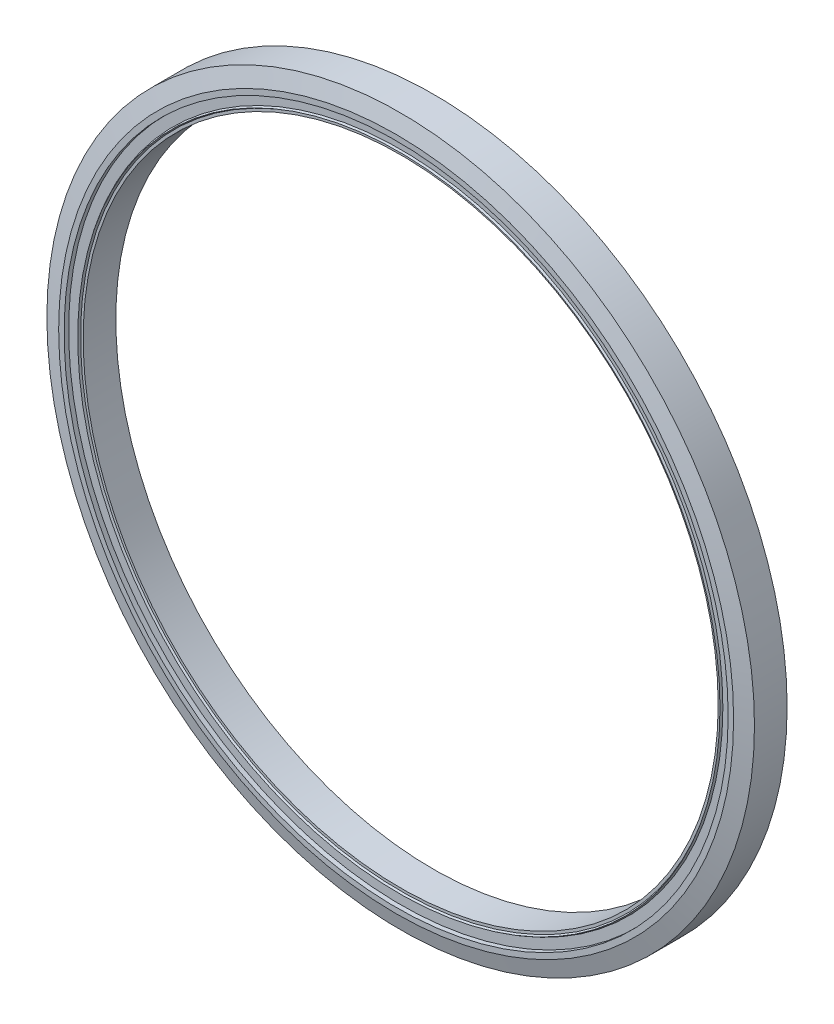
ISO-10303-21;
HEADER;
FILE_DESCRIPTION(('STEP AP214'),'2;1');
FILE_NAME('part.step','',(''),(''),'','','');
FILE_SCHEMA(('AUTOMOTIVE_DESIGN { 1 0 10303 214 1 1 1 1 }'));
ENDSEC;
DATA;
#1=APPLICATION_CONTEXT('core data for automotive mechanical design processes');
#2=APPLICATION_PROTOCOL_DEFINITION('international standard','automotive_design',2000,#1);
#3=PRODUCT_CONTEXT('',#1,'mechanical');
#4=PRODUCT('Part','Part','',(#3));
#5=PRODUCT_RELATED_PRODUCT_CATEGORY('part','',(#4));
#6=PRODUCT_DEFINITION_FORMATION('','',#4);
#7=PRODUCT_DEFINITION_CONTEXT('part definition',#1,'design');
#8=PRODUCT_DEFINITION('design','',#6,#7);
#9=PRODUCT_DEFINITION_SHAPE('','',#8);
#10=(LENGTH_UNIT() NAMED_UNIT(*) SI_UNIT(.MILLI.,.METRE.));
#11=(NAMED_UNIT(*) PLANE_ANGLE_UNIT() SI_UNIT($,.RADIAN.));
#12=(NAMED_UNIT(*) SI_UNIT($,.STERADIAN.) SOLID_ANGLE_UNIT());
#13=UNCERTAINTY_MEASURE_WITH_UNIT(LENGTH_MEASURE(1.E-05),#10,'distance_accuracy_value','');
#14=(GEOMETRIC_REPRESENTATION_CONTEXT(3) GLOBAL_UNCERTAINTY_ASSIGNED_CONTEXT((#13)) GLOBAL_UNIT_ASSIGNED_CONTEXT((#10,
#11,#12)) REPRESENTATION_CONTEXT('',''));
#15=CARTESIAN_POINT('',(0.,0.,0.));
#16=DIRECTION('',(0.,0.,1.));
#17=DIRECTION('',(1.,0.,0.));
#18=AXIS2_PLACEMENT_3D('',#15,#16,#17);
#19=CARTESIAN_POINT('',(0.,0.,0.9));
#20=DIRECTION('',(0.,0.,-1.));
#21=DIRECTION('',(-1.,0.,0.));
#22=AXIS2_PLACEMENT_3D('',#19,#20,#21);
#23=CONICAL_SURFACE('',#22,19.5,1.29984947645648);
#24=CARTESIAN_POINT('',(0.,0.,1.15));
#25=DIRECTION('',(0.,0.,1.));
#26=DIRECTION('',(1.,0.,0.));
#27=AXIS2_PLACEMENT_3D('',#24,#25,#26);
#28=CIRCLE('',#27,18.6);
#29=CARTESIAN_POINT('',(18.6,0.,1.15));
#30=VERTEX_POINT('',#29);
#31=EDGE_CURVE('E10',#30,#30,#28,.T.);
#32=ORIENTED_EDGE('',*,*,#31,.F.);
#33=EDGE_LOOP('',(#32));
#34=FACE_BOUND('',#33,.T.);
#35=CARTESIAN_POINT('',(0.,0.,0.9));
#36=DIRECTION('',(0.,0.,1.));
#37=DIRECTION('',(1.,0.,0.));
#38=AXIS2_PLACEMENT_3D('',#35,#36,#37);
#39=CIRCLE('',#38,19.5);
#40=CARTESIAN_POINT('',(19.5,0.,0.9));
#41=VERTEX_POINT('',#40);
#42=EDGE_CURVE('E93',#41,#41,#39,.T.);
#43=ORIENTED_EDGE('',*,*,#42,.T.);
#44=EDGE_LOOP('',(#43));
#45=FACE_BOUND('',#44,.T.);
#46=ADVANCED_FACE('F41',(#34,#45),#23,.T.);
#47=CARTESIAN_POINT('',(0.,18.3,1.15));
#48=DIRECTION('',(0.,0.,-1.));
#49=DIRECTION('',(-1.,0.,0.));
#50=AXIS2_PLACEMENT_3D('',#47,#48,#49);
#51=PLANE('',#50);
#52=CARTESIAN_POINT('',(0.,0.,1.15));
#53=DIRECTION('',(0.,0.,1.));
#54=DIRECTION('',(1.,0.,0.));
#55=AXIS2_PLACEMENT_3D('',#52,#53,#54);
#56=CIRCLE('',#55,18.3);
#57=CARTESIAN_POINT('',(18.3,0.,1.15));
#58=VERTEX_POINT('',#57);
#59=EDGE_CURVE('E47',#58,#58,#56,.T.);
#60=ORIENTED_EDGE('',*,*,#59,.F.);
#61=EDGE_LOOP('',(#60));
#62=FACE_BOUND('',#61,.T.);
#63=ORIENTED_EDGE('',*,*,#31,.T.);
#64=EDGE_LOOP('',(#63));
#65=FACE_BOUND('',#64,.T.);
#66=ADVANCED_FACE('F178',(#62,#65),#51,.F.);
#67=CARTESIAN_POINT('',(0.,0.,0.));
#68=DIRECTION('',(0.,0.,1.));
#69=DIRECTION('',(1.,0.,0.));
#70=AXIS2_PLACEMENT_3D('',#67,#68,#69);
#71=CYLINDRICAL_SURFACE('',#70,18.3);
#72=CARTESIAN_POINT('',(0.,0.,0.899999999999998));
#73=DIRECTION('',(0.,0.,1.));
#74=DIRECTION('',(1.,0.,0.));
#75=AXIS2_PLACEMENT_3D('',#72,#73,#74);
#76=CIRCLE('',#75,18.3);
#77=CARTESIAN_POINT('',(18.3,0.,0.899999999999998));
#78=VERTEX_POINT('',#77);
#79=EDGE_CURVE('E51',#78,#78,#76,.T.);
#80=ORIENTED_EDGE('',*,*,#79,.F.);
#81=EDGE_LOOP('',(#80));
#82=FACE_BOUND('',#81,.T.);
#83=ORIENTED_EDGE('',*,*,#59,.T.);
#84=EDGE_LOOP('',(#83));
#85=FACE_BOUND('',#84,.T.);
#86=ADVANCED_FACE('F173',(#82,#85),#71,.F.);
#87=CARTESIAN_POINT('',(0.,18.3,0.899999999999998));
#88=DIRECTION('',(0.,0.,-1.));
#89=DIRECTION('',(-1.,0.,0.));
#90=AXIS2_PLACEMENT_3D('',#87,#88,#89);
#91=PLANE('',#90);
#92=CARTESIAN_POINT('',(0.,0.,0.899999999999998));
#93=DIRECTION('',(0.,0.,1.));
#94=DIRECTION('',(1.,0.,0.));
#95=AXIS2_PLACEMENT_3D('',#92,#93,#94);
#96=CIRCLE('',#95,17.757735026919);
#97=CARTESIAN_POINT('',(17.757735026919,0.,0.899999999999998));
#98=VERTEX_POINT('',#97);
#99=EDGE_CURVE('E55',#98,#98,#96,.T.);
#100=ORIENTED_EDGE('',*,*,#99,.F.);
#101=EDGE_LOOP('',(#100));
#102=FACE_BOUND('',#101,.T.);
#103=ORIENTED_EDGE('',*,*,#79,.T.);
#104=EDGE_LOOP('',(#103));
#105=FACE_BOUND('',#104,.T.);
#106=ADVANCED_FACE('F167',(#102,#105),#91,.F.);
#107=CARTESIAN_POINT('',(0.,0.,0.899999999999998));
#108=DIRECTION('',(0.,0.,-1.));
#109=DIRECTION('',(-1.,0.,0.));
#110=AXIS2_PLACEMENT_3D('',#107,#108,#109);
#111=CONICAL_SURFACE('',#110,17.757735026919,0.523598775598298);
#112=CARTESIAN_POINT('',(0.,0.,1.));
#113=DIRECTION('',(0.,0.,1.));
#114=DIRECTION('',(1.,0.,0.));
#115=AXIS2_PLACEMENT_3D('',#112,#113,#114);
#116=CIRCLE('',#115,17.7);
#117=CARTESIAN_POINT('',(17.7,0.,1.));
#118=VERTEX_POINT('',#117);
#119=EDGE_CURVE('E60',#118,#118,#116,.T.);
#120=ORIENTED_EDGE('',*,*,#119,.F.);
#121=EDGE_LOOP('',(#120));
#122=FACE_BOUND('',#121,.T.);
#123=ORIENTED_EDGE('',*,*,#99,.T.);
#124=EDGE_LOOP('',(#123));
#125=FACE_BOUND('',#124,.T.);
#126=ADVANCED_FACE('F161',(#122,#125),#111,.T.);
#127=CARTESIAN_POINT('',(0.,0.,1.));
#128=DIRECTION('',(0.,0.,1.));
#129=DIRECTION('',(1.,0.,0.));
#130=AXIS2_PLACEMENT_3D('',#127,#128,#129);
#131=CONICAL_SURFACE('',#130,17.7,0.523598775598298);
#132=CARTESIAN_POINT('',(0.,0.,0.899999999999998));
#133=DIRECTION('',(0.,0.,1.));
#134=DIRECTION('',(1.,0.,0.));
#135=AXIS2_PLACEMENT_3D('',#132,#133,#134);
#136=CIRCLE('',#135,17.642264973081);
#137=CARTESIAN_POINT('',(17.642264973081,0.,0.899999999999998));
#138=VERTEX_POINT('',#137);
#139=EDGE_CURVE('E63',#138,#138,#136,.T.);
#140=ORIENTED_EDGE('',*,*,#139,.F.);
#141=EDGE_LOOP('',(#140));
#142=FACE_BOUND('',#141,.T.);
#143=ORIENTED_EDGE('',*,*,#119,.T.);
#144=EDGE_LOOP('',(#143));
#145=FACE_BOUND('',#144,.T.);
#146=ADVANCED_FACE('F155',(#142,#145),#131,.F.);
#147=CARTESIAN_POINT('',(0.,17.642264973081,0.899999999999998));
#148=DIRECTION('',(0.,0.,-1.));
#149=DIRECTION('',(-1.,0.,0.));
#150=AXIS2_PLACEMENT_3D('',#147,#148,#149);
#151=PLANE('',#150);
#152=CARTESIAN_POINT('',(0.,0.,0.899999999999998));
#153=DIRECTION('',(0.,0.,1.));
#154=DIRECTION('',(1.,0.,0.));
#155=AXIS2_PLACEMENT_3D('',#152,#153,#154);
#156=CIRCLE('',#155,17.5);
#157=CARTESIAN_POINT('',(17.5,0.,0.899999999999998));
#158=VERTEX_POINT('',#157);
#159=EDGE_CURVE('E66',#158,#158,#156,.T.);
#160=ORIENTED_EDGE('',*,*,#159,.F.);
#161=EDGE_LOOP('',(#160));
#162=FACE_BOUND('',#161,.T.);
#163=ORIENTED_EDGE('',*,*,#139,.T.);
#164=EDGE_LOOP('',(#163));
#165=FACE_BOUND('',#164,.T.);
#166=ADVANCED_FACE('F149',(#162,#165),#151,.F.);
#167=CARTESIAN_POINT('',(0.,0.,0.));
#168=DIRECTION('',(0.,0.,1.));
#169=DIRECTION('',(1.,0.,0.));
#170=AXIS2_PLACEMENT_3D('',#167,#168,#169);
#171=CYLINDRICAL_SURFACE('',#170,17.5);
#172=CARTESIAN_POINT('',(0.,0.,-0.899999999999998));
#173=DIRECTION('',(0.,0.,1.));
#174=DIRECTION('',(1.,0.,0.));
#175=AXIS2_PLACEMENT_3D('',#172,#173,#174);
#176=CIRCLE('',#175,17.5);
#177=CARTESIAN_POINT('',(17.5,0.,-0.899999999999998));
#178=VERTEX_POINT('',#177);
#179=EDGE_CURVE('E69',#178,#178,#176,.T.);
#180=ORIENTED_EDGE('',*,*,#179,.F.);
#181=EDGE_LOOP('',(#180));
#182=FACE_BOUND('',#181,.T.);
#183=ORIENTED_EDGE('',*,*,#159,.T.);
#184=EDGE_LOOP('',(#183));
#185=FACE_BOUND('',#184,.T.);
#186=ADVANCED_FACE('F143',(#182,#185),#171,.F.);
#187=CARTESIAN_POINT('',(0.,17.642264973081,-0.899999999999998));
#188=DIRECTION('',(0.,0.,1.));
#189=DIRECTION('',(1.,0.,0.));
#190=AXIS2_PLACEMENT_3D('',#187,#188,#189);
#191=PLANE('',#190);
#192=CARTESIAN_POINT('',(0.,0.,-0.899999999999998));
#193=DIRECTION('',(0.,0.,1.));
#194=DIRECTION('',(1.,0.,0.));
#195=AXIS2_PLACEMENT_3D('',#192,#193,#194);
#196=CIRCLE('',#195,17.642264973081);
#197=CARTESIAN_POINT('',(17.642264973081,0.,-0.899999999999998));
#198=VERTEX_POINT('',#197);
#199=EDGE_CURVE('E72',#198,#198,#196,.T.);
#200=ORIENTED_EDGE('',*,*,#199,.F.);
#201=EDGE_LOOP('',(#200));
#202=FACE_BOUND('',#201,.T.);
#203=ORIENTED_EDGE('',*,*,#179,.T.);
#204=EDGE_LOOP('',(#203));
#205=FACE_BOUND('',#204,.T.);
#206=ADVANCED_FACE('F137',(#202,#205),#191,.F.);
#207=CARTESIAN_POINT('',(0.,0.,-0.899999999999998));
#208=DIRECTION('',(0.,0.,-1.));
#209=DIRECTION('',(-1.,0.,0.));
#210=AXIS2_PLACEMENT_3D('',#207,#208,#209);
#211=CONICAL_SURFACE('',#210,17.642264973081,0.523598775598298);
#212=CARTESIAN_POINT('',(0.,0.,-1.));
#213=DIRECTION('',(0.,0.,1.));
#214=DIRECTION('',(1.,0.,0.));
#215=AXIS2_PLACEMENT_3D('',#212,#213,#214);
#216=CIRCLE('',#215,17.7);
#217=CARTESIAN_POINT('',(17.7,0.,-1.));
#218=VERTEX_POINT('',#217);
#219=EDGE_CURVE('E75',#218,#218,#216,.T.);
#220=ORIENTED_EDGE('',*,*,#219,.F.);
#221=EDGE_LOOP('',(#220));
#222=FACE_BOUND('',#221,.T.);
#223=ORIENTED_EDGE('',*,*,#199,.T.);
#224=EDGE_LOOP('',(#223));
#225=FACE_BOUND('',#224,.T.);
#226=ADVANCED_FACE('F131',(#222,#225),#211,.F.);
#227=CARTESIAN_POINT('',(0.,0.,-1.));
#228=DIRECTION('',(0.,0.,1.));
#229=DIRECTION('',(1.,0.,0.));
#230=AXIS2_PLACEMENT_3D('',#227,#228,#229);
#231=CONICAL_SURFACE('',#230,17.7,0.523598775598298);
#232=CARTESIAN_POINT('',(0.,0.,-0.899999999999998));
#233=DIRECTION('',(0.,0.,1.));
#234=DIRECTION('',(1.,0.,0.));
#235=AXIS2_PLACEMENT_3D('',#232,#233,#234);
#236=CIRCLE('',#235,17.757735026919);
#237=CARTESIAN_POINT('',(17.757735026919,0.,-0.899999999999998));
#238=VERTEX_POINT('',#237);
#239=EDGE_CURVE('E78',#238,#238,#236,.T.);
#240=ORIENTED_EDGE('',*,*,#239,.F.);
#241=EDGE_LOOP('',(#240));
#242=FACE_BOUND('',#241,.T.);
#243=ORIENTED_EDGE('',*,*,#219,.T.);
#244=EDGE_LOOP('',(#243));
#245=FACE_BOUND('',#244,.T.);
#246=ADVANCED_FACE('F125',(#242,#245),#231,.T.);
#247=CARTESIAN_POINT('',(0.,18.3,-0.899999999999998));
#248=DIRECTION('',(0.,0.,1.));
#249=DIRECTION('',(1.,0.,0.));
#250=AXIS2_PLACEMENT_3D('',#247,#248,#249);
#251=PLANE('',#250);
#252=CARTESIAN_POINT('',(0.,0.,-0.899999999999998));
#253=DIRECTION('',(0.,0.,1.));
#254=DIRECTION('',(1.,0.,0.));
#255=AXIS2_PLACEMENT_3D('',#252,#253,#254);
#256=CIRCLE('',#255,18.3);
#257=CARTESIAN_POINT('',(18.3,0.,-0.899999999999998));
#258=VERTEX_POINT('',#257);
#259=EDGE_CURVE('E81',#258,#258,#256,.T.);
#260=ORIENTED_EDGE('',*,*,#259,.F.);
#261=EDGE_LOOP('',(#260));
#262=FACE_BOUND('',#261,.T.);
#263=ORIENTED_EDGE('',*,*,#239,.T.);
#264=EDGE_LOOP('',(#263));
#265=FACE_BOUND('',#264,.T.);
#266=ADVANCED_FACE('F119',(#262,#265),#251,.F.);
#267=CARTESIAN_POINT('',(0.,0.,0.));
#268=DIRECTION('',(0.,0.,1.));
#269=DIRECTION('',(1.,0.,0.));
#270=AXIS2_PLACEMENT_3D('',#267,#268,#269);
#271=CYLINDRICAL_SURFACE('',#270,18.3);
#272=CARTESIAN_POINT('',(0.,0.,-1.15));
#273=DIRECTION('',(0.,0.,1.));
#274=DIRECTION('',(1.,0.,0.));
#275=AXIS2_PLACEMENT_3D('',#272,#273,#274);
#276=CIRCLE('',#275,18.3);
#277=CARTESIAN_POINT('',(18.3,0.,-1.15));
#278=VERTEX_POINT('',#277);
#279=EDGE_CURVE('E84',#278,#278,#276,.T.);
#280=ORIENTED_EDGE('',*,*,#279,.F.);
#281=EDGE_LOOP('',(#280));
#282=FACE_BOUND('',#281,.T.);
#283=ORIENTED_EDGE('',*,*,#259,.T.);
#284=EDGE_LOOP('',(#283));
#285=FACE_BOUND('',#284,.T.);
#286=ADVANCED_FACE('F113',(#282,#285),#271,.F.);
#287=CARTESIAN_POINT('',(0.,18.3,-1.15));
#288=DIRECTION('',(0.,0.,1.));
#289=DIRECTION('',(1.,0.,0.));
#290=AXIS2_PLACEMENT_3D('',#287,#288,#289);
#291=PLANE('',#290);
#292=CARTESIAN_POINT('',(0.,0.,-1.15));
#293=DIRECTION('',(0.,0.,1.));
#294=DIRECTION('',(1.,0.,0.));
#295=AXIS2_PLACEMENT_3D('',#292,#293,#294);
#296=CIRCLE('',#295,18.6);
#297=CARTESIAN_POINT('',(18.6,0.,-1.15));
#298=VERTEX_POINT('',#297);
#299=EDGE_CURVE('E87',#298,#298,#296,.T.);
#300=ORIENTED_EDGE('',*,*,#299,.F.);
#301=EDGE_LOOP('',(#300));
#302=FACE_BOUND('',#301,.T.);
#303=ORIENTED_EDGE('',*,*,#279,.T.);
#304=EDGE_LOOP('',(#303));
#305=FACE_BOUND('',#304,.T.);
#306=ADVANCED_FACE('F107',(#302,#305),#291,.F.);
#307=CARTESIAN_POINT('',(0.,0.,-1.15));
#308=DIRECTION('',(0.,0.,1.));
#309=DIRECTION('',(1.,0.,0.));
#310=AXIS2_PLACEMENT_3D('',#307,#308,#309);
#311=CONICAL_SURFACE('',#310,18.6,1.29984947645648);
#312=CARTESIAN_POINT('',(0.,0.,-0.9));
#313=DIRECTION('',(0.,0.,1.));
#314=DIRECTION('',(1.,0.,0.));
#315=AXIS2_PLACEMENT_3D('',#312,#313,#314);
#316=CIRCLE('',#315,19.5);
#317=CARTESIAN_POINT('',(19.5,0.,-0.9));
#318=VERTEX_POINT('',#317);
#319=EDGE_CURVE('E90',#318,#318,#316,.T.);
#320=ORIENTED_EDGE('',*,*,#319,.F.);
#321=EDGE_LOOP('',(#320));
#322=FACE_BOUND('',#321,.T.);
#323=ORIENTED_EDGE('',*,*,#299,.T.);
#324=EDGE_LOOP('',(#323));
#325=FACE_BOUND('',#324,.T.);
#326=ADVANCED_FACE('F101',(#322,#325),#311,.T.);
#327=CARTESIAN_POINT('',(0.,0.,0.));
#328=DIRECTION('',(0.,0.,1.));
#329=DIRECTION('',(1.,0.,0.));
#330=AXIS2_PLACEMENT_3D('',#327,#328,#329);
#331=CYLINDRICAL_SURFACE('',#330,19.5);
#332=ORIENTED_EDGE('',*,*,#42,.F.);
#333=EDGE_LOOP('',(#332));
#334=FACE_BOUND('',#333,.T.);
#335=ORIENTED_EDGE('',*,*,#319,.T.);
#336=EDGE_LOOP('',(#335));
#337=FACE_BOUND('',#336,.T.);
#338=ADVANCED_FACE('F98',(#334,#337),#331,.T.);
#339=CLOSED_SHELL('',(#46,#66,#86,#106,#126,#146,#166,#186,#206,#226,#246,#266,#286,#306,#326,#338));
#340=MANIFOLD_SOLID_BREP('B2',#339);
#341=ADVANCED_BREP_SHAPE_REPRESENTATION('',(#18,#340),#14);
#342=SHAPE_DEFINITION_REPRESENTATION(#9,#341);
ENDSEC;
END-ISO-10303-21;
